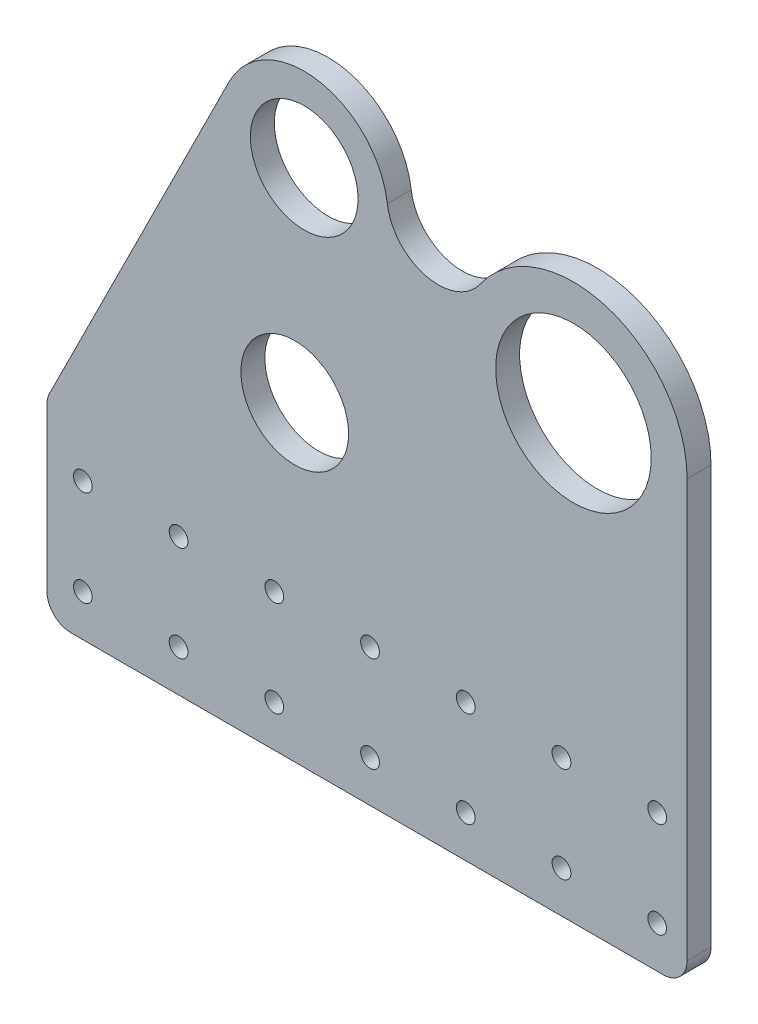
ISO-10303-21;
HEADER;
FILE_DESCRIPTION(('STEP AP214'),'2;1');
FILE_NAME('part.step','',(''),(''),'','','');
FILE_SCHEMA(('AUTOMOTIVE_DESIGN { 1 0 10303 214 1 1 1 1 }'));
ENDSEC;
DATA;
#1=APPLICATION_CONTEXT('core data for automotive mechanical design processes');
#2=APPLICATION_PROTOCOL_DEFINITION('international standard','automotive_design',2000,#1);
#3=PRODUCT_CONTEXT('',#1,'mechanical');
#4=PRODUCT('Part','Part','',(#3));
#5=PRODUCT_RELATED_PRODUCT_CATEGORY('part','',(#4));
#6=PRODUCT_DEFINITION_FORMATION('','',#4);
#7=PRODUCT_DEFINITION_CONTEXT('part definition',#1,'design');
#8=PRODUCT_DEFINITION('design','',#6,#7);
#9=PRODUCT_DEFINITION_SHAPE('','',#8);
#10=(LENGTH_UNIT() NAMED_UNIT(*) SI_UNIT(.MILLI.,.METRE.));
#11=(NAMED_UNIT(*) PLANE_ANGLE_UNIT() SI_UNIT($,.RADIAN.));
#12=(NAMED_UNIT(*) SI_UNIT($,.STERADIAN.) SOLID_ANGLE_UNIT());
#13=UNCERTAINTY_MEASURE_WITH_UNIT(LENGTH_MEASURE(1.E-05),#10,'distance_accuracy_value','');
#14=(GEOMETRIC_REPRESENTATION_CONTEXT(3) GLOBAL_UNCERTAINTY_ASSIGNED_CONTEXT((#13)) GLOBAL_UNIT_ASSIGNED_CONTEXT((#10,
#11,#12)) REPRESENTATION_CONTEXT('',''));
#15=CARTESIAN_POINT('',(0.,0.,0.));
#16=DIRECTION('',(0.,0.,1.));
#17=DIRECTION('',(1.,0.,0.));
#18=AXIS2_PLACEMENT_3D('',#15,#16,#17);
#19=CARTESIAN_POINT('',(609.6,111.4425,3.175));
#20=DIRECTION('',(0.,0.,-1.));
#21=DIRECTION('',(-1.,0.,0.));
#22=AXIS2_PLACEMENT_3D('',#19,#20,#21);
#23=CYLINDRICAL_SURFACE('',#22,2.48919999999995);
#24=CARTESIAN_POINT('',(609.6,111.4425,3.175));
#25=DIRECTION('',(0.,0.,1.));
#26=DIRECTION('',(1.,0.,0.));
#27=AXIS2_PLACEMENT_3D('',#24,#25,#26);
#28=CIRCLE('',#27,2.48919999999995);
#29=CARTESIAN_POINT('',(612.0892,111.4425,3.175));
#30=VERTEX_POINT('',#29);
#31=EDGE_CURVE('E260',#30,#30,#28,.T.);
#32=ORIENTED_EDGE('',*,*,#31,.T.);
#33=EDGE_LOOP('',(#32));
#34=FACE_BOUND('',#33,.T.);
#35=CARTESIAN_POINT('',(609.6,111.4425,-3.175));
#36=DIRECTION('',(0.,0.,1.));
#37=DIRECTION('',(1.,0.,0.));
#38=AXIS2_PLACEMENT_3D('',#35,#36,#37);
#39=CIRCLE('',#38,2.48919999999995);
#40=CARTESIAN_POINT('',(612.0892,111.4425,-3.175));
#41=VERTEX_POINT('',#40);
#42=EDGE_CURVE('E263',#41,#41,#39,.T.);
#43=ORIENTED_EDGE('',*,*,#42,.F.);
#44=EDGE_LOOP('',(#43));
#45=FACE_BOUND('',#44,.T.);
#46=ADVANCED_FACE('F39',(#34,#45),#23,.F.);
#47=CARTESIAN_POINT('',(609.6,136.8425,3.175));
#48=DIRECTION('',(0.,0.,-1.));
#49=DIRECTION('',(-1.,0.,0.));
#50=AXIS2_PLACEMENT_3D('',#47,#48,#49);
#51=CYLINDRICAL_SURFACE('',#50,2.48919999999995);
#52=CARTESIAN_POINT('',(609.6,136.8425,3.175));
#53=DIRECTION('',(0.,0.,1.));
#54=DIRECTION('',(1.,0.,0.));
#55=AXIS2_PLACEMENT_3D('',#52,#53,#54);
#56=CIRCLE('',#55,2.48919999999995);
#57=CARTESIAN_POINT('',(612.0892,136.8425,3.175));
#58=VERTEX_POINT('',#57);
#59=EDGE_CURVE('E254',#58,#58,#56,.T.);
#60=ORIENTED_EDGE('',*,*,#59,.T.);
#61=EDGE_LOOP('',(#60));
#62=FACE_BOUND('',#61,.T.);
#63=CARTESIAN_POINT('',(609.6,136.8425,-3.175));
#64=DIRECTION('',(0.,0.,1.));
#65=DIRECTION('',(1.,0.,0.));
#66=AXIS2_PLACEMENT_3D('',#63,#64,#65);
#67=CIRCLE('',#66,2.48919999999995);
#68=CARTESIAN_POINT('',(612.0892,136.8425,-3.175));
#69=VERTEX_POINT('',#68);
#70=EDGE_CURVE('E257',#69,#69,#67,.T.);
#71=ORIENTED_EDGE('',*,*,#70,.F.);
#72=EDGE_LOOP('',(#71));
#73=FACE_BOUND('',#72,.T.);
#74=ADVANCED_FACE('F321',(#62,#73),#51,.F.);
#75=CARTESIAN_POINT('',(584.2,111.4425,3.175));
#76=DIRECTION('',(0.,0.,-1.));
#77=DIRECTION('',(-1.,0.,0.));
#78=AXIS2_PLACEMENT_3D('',#75,#76,#77);
#79=CYLINDRICAL_SURFACE('',#78,2.48919999999995);
#80=CARTESIAN_POINT('',(584.2,111.4425,3.175));
#81=DIRECTION('',(0.,0.,1.));
#82=DIRECTION('',(1.,0.,0.));
#83=AXIS2_PLACEMENT_3D('',#80,#81,#82);
#84=CIRCLE('',#83,2.48919999999995);
#85=CARTESIAN_POINT('',(586.6892,111.4425,3.175));
#86=VERTEX_POINT('',#85);
#87=EDGE_CURVE('E248',#86,#86,#84,.T.);
#88=ORIENTED_EDGE('',*,*,#87,.T.);
#89=EDGE_LOOP('',(#88));
#90=FACE_BOUND('',#89,.T.);
#91=CARTESIAN_POINT('',(584.2,111.4425,-3.175));
#92=DIRECTION('',(0.,0.,1.));
#93=DIRECTION('',(1.,0.,0.));
#94=AXIS2_PLACEMENT_3D('',#91,#92,#93);
#95=CIRCLE('',#94,2.48919999999995);
#96=CARTESIAN_POINT('',(586.6892,111.4425,-3.175));
#97=VERTEX_POINT('',#96);
#98=EDGE_CURVE('E251',#97,#97,#95,.T.);
#99=ORIENTED_EDGE('',*,*,#98,.F.);
#100=EDGE_LOOP('',(#99));
#101=FACE_BOUND('',#100,.T.);
#102=ADVANCED_FACE('F327',(#90,#101),#79,.F.);
#103=CARTESIAN_POINT('',(584.2,136.8425,3.175));
#104=DIRECTION('',(0.,0.,-1.));
#105=DIRECTION('',(-1.,0.,0.));
#106=AXIS2_PLACEMENT_3D('',#103,#104,#105);
#107=CYLINDRICAL_SURFACE('',#106,2.48919999999995);
#108=CARTESIAN_POINT('',(584.2,136.8425,3.175));
#109=DIRECTION('',(0.,0.,1.));
#110=DIRECTION('',(1.,0.,0.));
#111=AXIS2_PLACEMENT_3D('',#108,#109,#110);
#112=CIRCLE('',#111,2.48919999999995);
#113=CARTESIAN_POINT('',(586.6892,136.8425,3.175));
#114=VERTEX_POINT('',#113);
#115=EDGE_CURVE('E242',#114,#114,#112,.T.);
#116=ORIENTED_EDGE('',*,*,#115,.T.);
#117=EDGE_LOOP('',(#116));
#118=FACE_BOUND('',#117,.T.);
#119=CARTESIAN_POINT('',(584.2,136.8425,-3.175));
#120=DIRECTION('',(0.,0.,1.));
#121=DIRECTION('',(1.,0.,0.));
#122=AXIS2_PLACEMENT_3D('',#119,#120,#121);
#123=CIRCLE('',#122,2.48919999999995);
#124=CARTESIAN_POINT('',(586.6892,136.8425,-3.175));
#125=VERTEX_POINT('',#124);
#126=EDGE_CURVE('E245',#125,#125,#123,.T.);
#127=ORIENTED_EDGE('',*,*,#126,.F.);
#128=EDGE_LOOP('',(#127));
#129=FACE_BOUND('',#128,.T.);
#130=ADVANCED_FACE('F411',(#118,#129),#107,.F.);
#131=CARTESIAN_POINT('',(558.8,111.4425,3.175));
#132=DIRECTION('',(0.,0.,-1.));
#133=DIRECTION('',(-1.,0.,0.));
#134=AXIS2_PLACEMENT_3D('',#131,#132,#133);
#135=CYLINDRICAL_SURFACE('',#134,2.48919999999995);
#136=CARTESIAN_POINT('',(558.8,111.4425,3.175));
#137=DIRECTION('',(0.,0.,1.));
#138=DIRECTION('',(1.,0.,0.));
#139=AXIS2_PLACEMENT_3D('',#136,#137,#138);
#140=CIRCLE('',#139,2.48919999999995);
#141=CARTESIAN_POINT('',(561.2892,111.4425,3.175));
#142=VERTEX_POINT('',#141);
#143=EDGE_CURVE('E236',#142,#142,#140,.T.);
#144=ORIENTED_EDGE('',*,*,#143,.T.);
#145=EDGE_LOOP('',(#144));
#146=FACE_BOUND('',#145,.T.);
#147=CARTESIAN_POINT('',(558.8,111.4425,-3.175));
#148=DIRECTION('',(0.,0.,1.));
#149=DIRECTION('',(1.,0.,0.));
#150=AXIS2_PLACEMENT_3D('',#147,#148,#149);
#151=CIRCLE('',#150,2.48919999999995);
#152=CARTESIAN_POINT('',(561.2892,111.4425,-3.175));
#153=VERTEX_POINT('',#152);
#154=EDGE_CURVE('E239',#153,#153,#151,.T.);
#155=ORIENTED_EDGE('',*,*,#154,.F.);
#156=EDGE_LOOP('',(#155));
#157=FACE_BOUND('',#156,.T.);
#158=ADVANCED_FACE('F407',(#146,#157),#135,.F.);
#159=CARTESIAN_POINT('',(558.8,136.8425,3.175));
#160=DIRECTION('',(0.,0.,-1.));
#161=DIRECTION('',(-1.,0.,0.));
#162=AXIS2_PLACEMENT_3D('',#159,#160,#161);
#163=CYLINDRICAL_SURFACE('',#162,2.48919999999995);
#164=CARTESIAN_POINT('',(558.8,136.8425,3.175));
#165=DIRECTION('',(0.,0.,1.));
#166=DIRECTION('',(1.,0.,0.));
#167=AXIS2_PLACEMENT_3D('',#164,#165,#166);
#168=CIRCLE('',#167,2.48919999999995);
#169=CARTESIAN_POINT('',(561.2892,136.8425,3.175));
#170=VERTEX_POINT('',#169);
#171=EDGE_CURVE('E230',#170,#170,#168,.T.);
#172=ORIENTED_EDGE('',*,*,#171,.T.);
#173=EDGE_LOOP('',(#172));
#174=FACE_BOUND('',#173,.T.);
#175=CARTESIAN_POINT('',(558.8,136.8425,-3.175));
#176=DIRECTION('',(0.,0.,1.));
#177=DIRECTION('',(1.,0.,0.));
#178=AXIS2_PLACEMENT_3D('',#175,#176,#177);
#179=CIRCLE('',#178,2.48919999999995);
#180=CARTESIAN_POINT('',(561.2892,136.8425,-3.175));
#181=VERTEX_POINT('',#180);
#182=EDGE_CURVE('E233',#181,#181,#179,.T.);
#183=ORIENTED_EDGE('',*,*,#182,.F.);
#184=EDGE_LOOP('',(#183));
#185=FACE_BOUND('',#184,.T.);
#186=ADVANCED_FACE('F403',(#174,#185),#163,.F.);
#187=CARTESIAN_POINT('',(533.4,111.4425,3.175));
#188=DIRECTION('',(0.,0.,-1.));
#189=DIRECTION('',(-1.,0.,0.));
#190=AXIS2_PLACEMENT_3D('',#187,#188,#189);
#191=CYLINDRICAL_SURFACE('',#190,2.48919999999995);
#192=CARTESIAN_POINT('',(533.4,111.4425,3.175));
#193=DIRECTION('',(0.,0.,1.));
#194=DIRECTION('',(1.,0.,0.));
#195=AXIS2_PLACEMENT_3D('',#192,#193,#194);
#196=CIRCLE('',#195,2.48919999999995);
#197=CARTESIAN_POINT('',(535.8892,111.4425,3.175));
#198=VERTEX_POINT('',#197);
#199=EDGE_CURVE('E224',#198,#198,#196,.T.);
#200=ORIENTED_EDGE('',*,*,#199,.T.);
#201=EDGE_LOOP('',(#200));
#202=FACE_BOUND('',#201,.T.);
#203=CARTESIAN_POINT('',(533.4,111.4425,-3.175));
#204=DIRECTION('',(0.,0.,1.));
#205=DIRECTION('',(1.,0.,0.));
#206=AXIS2_PLACEMENT_3D('',#203,#204,#205);
#207=CIRCLE('',#206,2.48919999999995);
#208=CARTESIAN_POINT('',(535.8892,111.4425,-3.175));
#209=VERTEX_POINT('',#208);
#210=EDGE_CURVE('E227',#209,#209,#207,.T.);
#211=ORIENTED_EDGE('',*,*,#210,.F.);
#212=EDGE_LOOP('',(#211));
#213=FACE_BOUND('',#212,.T.);
#214=ADVANCED_FACE('F399',(#202,#213),#191,.F.);
#215=CARTESIAN_POINT('',(533.4,136.8425,3.175));
#216=DIRECTION('',(0.,0.,-1.));
#217=DIRECTION('',(-1.,0.,0.));
#218=AXIS2_PLACEMENT_3D('',#215,#216,#217);
#219=CYLINDRICAL_SURFACE('',#218,2.48919999999995);
#220=CARTESIAN_POINT('',(533.4,136.8425,3.175));
#221=DIRECTION('',(0.,0.,1.));
#222=DIRECTION('',(1.,0.,0.));
#223=AXIS2_PLACEMENT_3D('',#220,#221,#222);
#224=CIRCLE('',#223,2.48919999999995);
#225=CARTESIAN_POINT('',(535.8892,136.8425,3.175));
#226=VERTEX_POINT('',#225);
#227=EDGE_CURVE('E218',#226,#226,#224,.T.);
#228=ORIENTED_EDGE('',*,*,#227,.T.);
#229=EDGE_LOOP('',(#228));
#230=FACE_BOUND('',#229,.T.);
#231=CARTESIAN_POINT('',(533.4,136.8425,-3.175));
#232=DIRECTION('',(0.,0.,1.));
#233=DIRECTION('',(1.,0.,0.));
#234=AXIS2_PLACEMENT_3D('',#231,#232,#233);
#235=CIRCLE('',#234,2.48919999999995);
#236=CARTESIAN_POINT('',(535.8892,136.8425,-3.175));
#237=VERTEX_POINT('',#236);
#238=EDGE_CURVE('E221',#237,#237,#235,.T.);
#239=ORIENTED_EDGE('',*,*,#238,.F.);
#240=EDGE_LOOP('',(#239));
#241=FACE_BOUND('',#240,.T.);
#242=ADVANCED_FACE('F395',(#230,#241),#219,.F.);
#243=CARTESIAN_POINT('',(508.,111.4425,3.175));
#244=DIRECTION('',(0.,0.,-1.));
#245=DIRECTION('',(-1.,0.,0.));
#246=AXIS2_PLACEMENT_3D('',#243,#244,#245);
#247=CYLINDRICAL_SURFACE('',#246,2.48919999999995);
#248=CARTESIAN_POINT('',(508.,111.4425,3.175));
#249=DIRECTION('',(0.,0.,1.));
#250=DIRECTION('',(1.,0.,0.));
#251=AXIS2_PLACEMENT_3D('',#248,#249,#250);
#252=CIRCLE('',#251,2.48919999999995);
#253=CARTESIAN_POINT('',(510.4892,111.4425,3.175));
#254=VERTEX_POINT('',#253);
#255=EDGE_CURVE('E212',#254,#254,#252,.T.);
#256=ORIENTED_EDGE('',*,*,#255,.T.);
#257=EDGE_LOOP('',(#256));
#258=FACE_BOUND('',#257,.T.);
#259=CARTESIAN_POINT('',(508.,111.4425,-3.175));
#260=DIRECTION('',(0.,0.,1.));
#261=DIRECTION('',(1.,0.,0.));
#262=AXIS2_PLACEMENT_3D('',#259,#260,#261);
#263=CIRCLE('',#262,2.48919999999995);
#264=CARTESIAN_POINT('',(510.4892,111.4425,-3.175));
#265=VERTEX_POINT('',#264);
#266=EDGE_CURVE('E215',#265,#265,#263,.T.);
#267=ORIENTED_EDGE('',*,*,#266,.F.);
#268=EDGE_LOOP('',(#267));
#269=FACE_BOUND('',#268,.T.);
#270=ADVANCED_FACE('F391',(#258,#269),#247,.F.);
#271=CARTESIAN_POINT('',(508.,136.8425,3.175));
#272=DIRECTION('',(0.,0.,-1.));
#273=DIRECTION('',(-1.,0.,0.));
#274=AXIS2_PLACEMENT_3D('',#271,#272,#273);
#275=CYLINDRICAL_SURFACE('',#274,2.48919999999995);
#276=CARTESIAN_POINT('',(508.,136.8425,3.175));
#277=DIRECTION('',(0.,0.,1.));
#278=DIRECTION('',(1.,0.,0.));
#279=AXIS2_PLACEMENT_3D('',#276,#277,#278);
#280=CIRCLE('',#279,2.48919999999995);
#281=CARTESIAN_POINT('',(510.4892,136.8425,3.175));
#282=VERTEX_POINT('',#281);
#283=EDGE_CURVE('E206',#282,#282,#280,.T.);
#284=ORIENTED_EDGE('',*,*,#283,.T.);
#285=EDGE_LOOP('',(#284));
#286=FACE_BOUND('',#285,.T.);
#287=CARTESIAN_POINT('',(508.,136.8425,-3.175));
#288=DIRECTION('',(0.,0.,1.));
#289=DIRECTION('',(1.,0.,0.));
#290=AXIS2_PLACEMENT_3D('',#287,#288,#289);
#291=CIRCLE('',#290,2.48919999999995);
#292=CARTESIAN_POINT('',(510.4892,136.8425,-3.175));
#293=VERTEX_POINT('',#292);
#294=EDGE_CURVE('E209',#293,#293,#291,.T.);
#295=ORIENTED_EDGE('',*,*,#294,.F.);
#296=EDGE_LOOP('',(#295));
#297=FACE_BOUND('',#296,.T.);
#298=ADVANCED_FACE('F387',(#286,#297),#275,.F.);
#299=CARTESIAN_POINT('',(482.6,111.4425,3.175));
#300=DIRECTION('',(0.,0.,-1.));
#301=DIRECTION('',(-1.,0.,0.));
#302=AXIS2_PLACEMENT_3D('',#299,#300,#301);
#303=CYLINDRICAL_SURFACE('',#302,2.48919999999995);
#304=CARTESIAN_POINT('',(482.6,111.4425,3.175));
#305=DIRECTION('',(0.,0.,1.));
#306=DIRECTION('',(1.,0.,0.));
#307=AXIS2_PLACEMENT_3D('',#304,#305,#306);
#308=CIRCLE('',#307,2.48919999999995);
#309=CARTESIAN_POINT('',(485.0892,111.4425,3.175));
#310=VERTEX_POINT('',#309);
#311=EDGE_CURVE('E200',#310,#310,#308,.T.);
#312=ORIENTED_EDGE('',*,*,#311,.T.);
#313=EDGE_LOOP('',(#312));
#314=FACE_BOUND('',#313,.T.);
#315=CARTESIAN_POINT('',(482.6,111.4425,-3.175));
#316=DIRECTION('',(0.,0.,1.));
#317=DIRECTION('',(1.,0.,0.));
#318=AXIS2_PLACEMENT_3D('',#315,#316,#317);
#319=CIRCLE('',#318,2.48919999999995);
#320=CARTESIAN_POINT('',(485.0892,111.4425,-3.175));
#321=VERTEX_POINT('',#320);
#322=EDGE_CURVE('E203',#321,#321,#319,.T.);
#323=ORIENTED_EDGE('',*,*,#322,.F.);
#324=EDGE_LOOP('',(#323));
#325=FACE_BOUND('',#324,.T.);
#326=ADVANCED_FACE('F383',(#314,#325),#303,.F.);
#327=CARTESIAN_POINT('',(482.6,136.8425,3.175));
#328=DIRECTION('',(0.,0.,-1.));
#329=DIRECTION('',(-1.,0.,0.));
#330=AXIS2_PLACEMENT_3D('',#327,#328,#329);
#331=CYLINDRICAL_SURFACE('',#330,2.48919999999995);
#332=CARTESIAN_POINT('',(482.6,136.8425,3.175));
#333=DIRECTION('',(0.,0.,1.));
#334=DIRECTION('',(1.,0.,0.));
#335=AXIS2_PLACEMENT_3D('',#332,#333,#334);
#336=CIRCLE('',#335,2.48919999999995);
#337=CARTESIAN_POINT('',(485.0892,136.8425,3.175));
#338=VERTEX_POINT('',#337);
#339=EDGE_CURVE('E127',#338,#338,#336,.T.);
#340=ORIENTED_EDGE('',*,*,#339,.T.);
#341=EDGE_LOOP('',(#340));
#342=FACE_BOUND('',#341,.T.);
#343=CARTESIAN_POINT('',(482.6,136.8425,-3.175));
#344=DIRECTION('',(0.,0.,1.));
#345=DIRECTION('',(1.,0.,0.));
#346=AXIS2_PLACEMENT_3D('',#343,#344,#345);
#347=CIRCLE('',#346,2.48919999999995);
#348=CARTESIAN_POINT('',(485.0892,136.8425,-3.175));
#349=VERTEX_POINT('',#348);
#350=EDGE_CURVE('E197',#349,#349,#347,.T.);
#351=ORIENTED_EDGE('',*,*,#350,.F.);
#352=EDGE_LOOP('',(#351));
#353=FACE_BOUND('',#352,.T.);
#354=ADVANCED_FACE('F362',(#342,#353),#331,.F.);
#355=CARTESIAN_POINT('',(551.528534377815,242.755181923313,3.175));
#356=DIRECTION('',(0.,0.,-1.));
#357=DIRECTION('',(-1.,0.,0.));
#358=AXIS2_PLACEMENT_3D('',#355,#356,#357);
#359=CYLINDRICAL_SURFACE('',#358,13.6578136002693);
#360=CARTESIAN_POINT('',(551.528534377815,242.755181923313,-3.175));
#361=DIRECTION('',(0.,0.,1.));
#362=DIRECTION('',(1.,0.,0.));
#363=AXIS2_PLACEMENT_3D('',#360,#361,#362);
#364=CIRCLE('',#363,13.6578136002693);
#365=CARTESIAN_POINT('',(537.981778574659,241.01699909364,-3.175));
#366=VERTEX_POINT('',#365);
#367=CARTESIAN_POINT('',(562.701077554075,234.899601020903,-3.175));
#368=VERTEX_POINT('',#367);
#369=EDGE_CURVE('E123',#366,#368,#364,.T.);
#370=ORIENTED_EDGE('',*,*,#369,.F.);
#371=DIRECTION('',(0.,0.,-1.));
#372=VECTOR('',#371,1.);
#373=CARTESIAN_POINT('',(537.981778574659,241.01699909364,3.175));
#374=LINE('',#373,#372);
#375=CARTESIAN_POINT('',(537.981778574659,241.01699909364,3.175));
#376=VERTEX_POINT('',#375);
#377=EDGE_CURVE('E117',#376,#366,#374,.T.);
#378=ORIENTED_EDGE('',*,*,#377,.F.);
#379=CARTESIAN_POINT('',(551.528534377815,242.755181923313,3.175));
#380=DIRECTION('',(0.,0.,1.));
#381=DIRECTION('',(1.,0.,0.));
#382=AXIS2_PLACEMENT_3D('',#379,#380,#381);
#383=CIRCLE('',#382,13.6578136002693);
#384=CARTESIAN_POINT('',(562.701077554075,234.899601020903,3.175));
#385=VERTEX_POINT('',#384);
#386=EDGE_CURVE('E121',#376,#385,#383,.T.);
#387=ORIENTED_EDGE('',*,*,#386,.T.);
#388=DIRECTION('',(0.,0.,-1.));
#389=VECTOR('',#388,1.);
#390=CARTESIAN_POINT('',(562.701077554075,234.899601020903,3.175));
#391=LINE('',#390,#389);
#392=EDGE_CURVE('E158',#385,#368,#391,.T.);
#393=ORIENTED_EDGE('',*,*,#392,.T.);
#394=EDGE_LOOP('',(#370,#378,#387,#393));
#395=FACE_BOUND('',#394,.T.);
#396=ADVANCED_FACE('F119',(#395),#359,.F.);
#397=CARTESIAN_POINT('',(515.937499999998,238.1885,3.175));
#398=DIRECTION('',(0.,0.,-1.));
#399=DIRECTION('',(-1.,0.,0.));
#400=AXIS2_PLACEMENT_3D('',#397,#398,#399);
#401=CYLINDRICAL_SURFACE('',#400,22.225);
#402=CARTESIAN_POINT('',(515.937499999998,238.1885,-3.175));
#403=DIRECTION('',(0.,0.,1.));
#404=DIRECTION('',(1.,0.,0.));
#405=AXIS2_PLACEMENT_3D('',#402,#403,#404);
#406=CIRCLE('',#405,22.225);
#407=CARTESIAN_POINT('',(496.052024065169,248.114147175139,-3.175));
#408=VERTEX_POINT('',#407);
#409=EDGE_CURVE('E175',#366,#408,#406,.T.);
#410=ORIENTED_EDGE('',*,*,#409,.T.);
#411=DIRECTION('',(0.,0.,-1.));
#412=VECTOR('',#411,1.);
#413=CARTESIAN_POINT('',(496.052024065169,248.114147175139,3.175));
#414=LINE('',#413,#412);
#415=CARTESIAN_POINT('',(496.052024065169,248.114147175139,3.175));
#416=VERTEX_POINT('',#415);
#417=EDGE_CURVE('E128',#416,#408,#414,.T.);
#418=ORIENTED_EDGE('',*,*,#417,.F.);
#419=CARTESIAN_POINT('',(515.937499999998,238.1885,3.175));
#420=DIRECTION('',(0.,0.,1.));
#421=DIRECTION('',(1.,0.,0.));
#422=AXIS2_PLACEMENT_3D('',#419,#420,#421);
#423=CIRCLE('',#422,22.225);
#424=EDGE_CURVE('E132',#376,#416,#423,.T.);
#425=ORIENTED_EDGE('',*,*,#424,.F.);
#426=ORIENTED_EDGE('',*,*,#377,.T.);
#427=EDGE_LOOP('',(#410,#418,#425,#426));
#428=FACE_BOUND('',#427,.T.);
#429=ADVANCED_FACE('F133',(#428),#401,.T.);
#430=CARTESIAN_POINT('',(297.971255611748,-148.729533113928,3.175));
#431=DIRECTION('',(-0.894734575245392,0.446598298093989,0.));
#432=DIRECTION('',(-0.446598298093989,-0.894734575245392,0.));
#433=AXIS2_PLACEMENT_3D('',#430,#431,#432);
#434=PLANE('',#433);
#435=DIRECTION('',(0.446598298093989,0.894734575245392,0.));
#436=VECTOR('',#435,1.);
#437=CARTESIAN_POINT('',(297.971255611748,-148.729533113928,-3.175));
#438=LINE('',#437,#436);
#439=CARTESIAN_POINT('',(448.343435447192,152.532672828187,-3.175));
#440=VERTEX_POINT('',#439);
#441=EDGE_CURVE('E177',#440,#408,#438,.T.);
#442=ORIENTED_EDGE('',*,*,#441,.F.);
#443=DIRECTION('',(0.,0.,-1.));
#444=VECTOR('',#443,1.);
#445=CARTESIAN_POINT('',(448.343435447192,152.532672828187,3.175));
#446=LINE('',#445,#444);
#447=CARTESIAN_POINT('',(448.343435447192,152.532672828187,3.175));
#448=VERTEX_POINT('',#447);
#449=EDGE_CURVE('E277',#440,#448,#446,.F.);
#450=ORIENTED_EDGE('',*,*,#449,.T.);
#451=DIRECTION('',(0.446598298093989,0.894734575245392,0.));
#452=VECTOR('',#451,1.);
#453=CARTESIAN_POINT('',(297.971255611748,-148.729533113928,3.175));
#454=LINE('',#453,#452);
#455=EDGE_CURVE('E136',#448,#416,#454,.T.);
#456=ORIENTED_EDGE('',*,*,#455,.T.);
#457=ORIENTED_EDGE('',*,*,#417,.T.);
#458=EDGE_LOOP('',(#442,#450,#456,#457));
#459=FACE_BOUND('',#458,.T.);
#460=ADVANCED_FACE('F307',(#459),#434,.T.);
#461=CARTESIAN_POINT('',(447.675,0.,3.175));
#462=DIRECTION('',(-1.,0.,0.));
#463=DIRECTION('',(0.,0.,1.));
#464=AXIS2_PLACEMENT_3D('',#461,#462,#463);
#465=PLANE('',#464);
#466=DIRECTION('',(0.,1.,0.));
#467=VECTOR('',#466,1.);
#468=CARTESIAN_POINT('',(447.675,0.,3.175));
#469=LINE('',#468,#467);
#470=CARTESIAN_POINT('',(447.675,106.7435,3.175));
#471=VERTEX_POINT('',#470);
#472=CARTESIAN_POINT('',(447.675,149.69677363529,3.175));
#473=VERTEX_POINT('',#472);
#474=EDGE_CURVE('E150',#471,#473,#469,.T.);
#475=ORIENTED_EDGE('',*,*,#474,.T.);
#476=DIRECTION('',(0.,0.,-1.));
#477=VECTOR('',#476,1.);
#478=CARTESIAN_POINT('',(447.675,149.69677363529,3.175));
#479=LINE('',#478,#477);
#480=CARTESIAN_POINT('',(447.675,149.69677363529,-3.175));
#481=VERTEX_POINT('',#480);
#482=EDGE_CURVE('E268',#473,#481,#479,.T.);
#483=ORIENTED_EDGE('',*,*,#482,.T.);
#484=DIRECTION('',(0.,1.,0.));
#485=VECTOR('',#484,1.);
#486=CARTESIAN_POINT('',(447.675,0.,-3.175));
#487=LINE('',#486,#485);
#488=CARTESIAN_POINT('',(447.675,106.7435,-3.175));
#489=VERTEX_POINT('',#488);
#490=EDGE_CURVE('E179',#489,#481,#487,.T.);
#491=ORIENTED_EDGE('',*,*,#490,.F.);
#492=DIRECTION('',(0.,0.,-1.));
#493=VECTOR('',#492,1.);
#494=CARTESIAN_POINT('',(447.675,106.7435,3.175));
#495=LINE('',#494,#493);
#496=EDGE_CURVE('E266',#489,#471,#495,.F.);
#497=ORIENTED_EDGE('',*,*,#496,.T.);
#498=EDGE_LOOP('',(#475,#483,#491,#497));
#499=FACE_BOUND('',#498,.T.);
#500=ADVANCED_FACE('F314',(#499),#465,.T.);
#501=CARTESIAN_POINT('',(0.,100.3935,3.175));
#502=DIRECTION('',(0.,1.,0.));
#503=DIRECTION('',(0.,0.,1.));
#504=AXIS2_PLACEMENT_3D('',#501,#502,#503);
#505=PLANE('',#504);
#506=DIRECTION('',(1.,0.,0.));
#507=VECTOR('',#506,1.);
#508=CARTESIAN_POINT('',(0.,100.3935,-3.175));
#509=LINE('',#508,#507);
#510=CARTESIAN_POINT('',(454.025,100.3935,-3.175));
#511=VERTEX_POINT('',#510);
#512=CARTESIAN_POINT('',(611.1875,100.3935,-3.175));
#513=VERTEX_POINT('',#512);
#514=EDGE_CURVE('E182',#511,#513,#509,.T.);
#515=ORIENTED_EDGE('',*,*,#514,.T.);
#516=DIRECTION('',(0.,0.,-1.));
#517=VECTOR('',#516,1.);
#518=CARTESIAN_POINT('',(611.1875,100.3935,3.175));
#519=LINE('',#518,#517);
#520=CARTESIAN_POINT('',(611.1875,100.3935,3.175));
#521=VERTEX_POINT('',#520);
#522=EDGE_CURVE('E11',#513,#521,#519,.F.);
#523=ORIENTED_EDGE('',*,*,#522,.T.);
#524=DIRECTION('',(1.,0.,0.));
#525=VECTOR('',#524,1.);
#526=CARTESIAN_POINT('',(0.,100.3935,3.175));
#527=LINE('',#526,#525);
#528=CARTESIAN_POINT('',(454.025,100.3935,3.175));
#529=VERTEX_POINT('',#528);
#530=EDGE_CURVE('E153',#529,#521,#527,.T.);
#531=ORIENTED_EDGE('',*,*,#530,.F.);
#532=DIRECTION('',(0.,0.,-1.));
#533=VECTOR('',#532,1.);
#534=CARTESIAN_POINT('',(454.025,100.3935,-3.175));
#535=LINE('',#534,#533);
#536=EDGE_CURVE('E47',#529,#511,#535,.T.);
#537=ORIENTED_EDGE('',*,*,#536,.T.);
#538=EDGE_LOOP('',(#515,#523,#531,#537));
#539=FACE_BOUND('',#538,.T.);
#540=ADVANCED_FACE('F289',(#539),#505,.F.);
#541=CARTESIAN_POINT('',(617.5375,0.,3.175));
#542=DIRECTION('',(1.,0.,0.));
#543=DIRECTION('',(0.,0.,-1.));
#544=AXIS2_PLACEMENT_3D('',#541,#542,#543);
#545=PLANE('',#544);
#546=DIRECTION('',(0.,-1.,0.));
#547=VECTOR('',#546,1.);
#548=CARTESIAN_POINT('',(617.5375,0.,3.175));
#549=LINE('',#548,#547);
#550=CARTESIAN_POINT('',(617.5375,217.551,3.175));
#551=VERTEX_POINT('',#550);
#552=CARTESIAN_POINT('',(617.5375,106.7435,3.175));
#553=VERTEX_POINT('',#552);
#554=EDGE_CURVE('E155',#551,#553,#549,.T.);
#555=ORIENTED_EDGE('',*,*,#554,.T.);
#556=DIRECTION('',(0.,0.,-1.));
#557=VECTOR('',#556,1.);
#558=CARTESIAN_POINT('',(617.5375,106.7435,-3.175));
#559=LINE('',#558,#557);
#560=CARTESIAN_POINT('',(617.5375,106.7435,-3.175));
#561=VERTEX_POINT('',#560);
#562=EDGE_CURVE('E284',#553,#561,#559,.T.);
#563=ORIENTED_EDGE('',*,*,#562,.T.);
#564=DIRECTION('',(0.,-1.,0.));
#565=VECTOR('',#564,1.);
#566=CARTESIAN_POINT('',(617.5375,0.,-3.175));
#567=LINE('',#566,#565);
#568=CARTESIAN_POINT('',(617.5375,217.551,-3.175));
#569=VERTEX_POINT('',#568);
#570=EDGE_CURVE('E184',#569,#561,#567,.T.);
#571=ORIENTED_EDGE('',*,*,#570,.F.);
#572=DIRECTION('',(0.,0.,-1.));
#573=VECTOR('',#572,1.);
#574=CARTESIAN_POINT('',(617.5375,217.551,3.175));
#575=LINE('',#574,#573);
#576=EDGE_CURVE('E192',#551,#569,#575,.T.);
#577=ORIENTED_EDGE('',*,*,#576,.F.);
#578=EDGE_LOOP('',(#555,#563,#571,#577));
#579=FACE_BOUND('',#578,.T.);
#580=ADVANCED_FACE('F301',(#579),#545,.T.);
#581=CARTESIAN_POINT('',(457.2,136.8425,3.175));
#582=DIRECTION('',(0.,0.,-1.));
#583=DIRECTION('',(-1.,0.,0.));
#584=AXIS2_PLACEMENT_3D('',#581,#582,#583);
#585=CYLINDRICAL_SURFACE('',#584,2.48919999999995);
#586=CARTESIAN_POINT('',(457.2,136.8425,3.175));
#587=DIRECTION('',(0.,0.,1.));
#588=DIRECTION('',(1.,0.,0.));
#589=AXIS2_PLACEMENT_3D('',#586,#587,#588);
#590=CIRCLE('',#589,2.48919999999995);
#591=CARTESIAN_POINT('',(459.6892,136.8425,3.175));
#592=VERTEX_POINT('',#591);
#593=EDGE_CURVE('E142',#592,#592,#590,.T.);
#594=ORIENTED_EDGE('',*,*,#593,.T.);
#595=EDGE_LOOP('',(#594));
#596=FACE_BOUND('',#595,.T.);
#597=CARTESIAN_POINT('',(457.2,136.8425,-3.175));
#598=DIRECTION('',(0.,0.,1.));
#599=DIRECTION('',(1.,0.,0.));
#600=AXIS2_PLACEMENT_3D('',#597,#598,#599);
#601=CIRCLE('',#600,2.48919999999995);
#602=CARTESIAN_POINT('',(459.6892,136.8425,-3.175));
#603=VERTEX_POINT('',#602);
#604=EDGE_CURVE('E171',#603,#603,#601,.T.);
#605=ORIENTED_EDGE('',*,*,#604,.F.);
#606=EDGE_LOOP('',(#605));
#607=FACE_BOUND('',#606,.T.);
#608=ADVANCED_FACE('F351',(#596,#607),#585,.F.);
#609=CARTESIAN_POINT('',(457.2,111.4425,3.175));
#610=DIRECTION('',(0.,0.,-1.));
#611=DIRECTION('',(-1.,0.,0.));
#612=AXIS2_PLACEMENT_3D('',#609,#610,#611);
#613=CYLINDRICAL_SURFACE('',#612,2.48919999999995);
#614=CARTESIAN_POINT('',(457.2,111.4425,3.175));
#615=DIRECTION('',(0.,0.,1.));
#616=DIRECTION('',(1.,0.,0.));
#617=AXIS2_PLACEMENT_3D('',#614,#615,#616);
#618=CIRCLE('',#617,2.48919999999995);
#619=CARTESIAN_POINT('',(459.6892,111.4425,3.175));
#620=VERTEX_POINT('',#619);
#621=EDGE_CURVE('E145',#620,#620,#618,.T.);
#622=ORIENTED_EDGE('',*,*,#621,.T.);
#623=EDGE_LOOP('',(#622));
#624=FACE_BOUND('',#623,.T.);
#625=CARTESIAN_POINT('',(457.2,111.4425,-3.175));
#626=DIRECTION('',(0.,0.,1.));
#627=DIRECTION('',(1.,0.,0.));
#628=AXIS2_PLACEMENT_3D('',#625,#626,#627);
#629=CIRCLE('',#628,2.48919999999995);
#630=CARTESIAN_POINT('',(459.6892,111.4425,-3.175));
#631=VERTEX_POINT('',#630);
#632=EDGE_CURVE('E168',#631,#631,#629,.T.);
#633=ORIENTED_EDGE('',*,*,#632,.F.);
#634=EDGE_LOOP('',(#633));
#635=FACE_BOUND('',#634,.T.);
#636=ADVANCED_FACE('F365',(#624,#635),#613,.F.);
#637=CARTESIAN_POINT('',(513.421091269929,182.9435,3.175));
#638=DIRECTION('',(0.,0.,-1.));
#639=DIRECTION('',(-1.,0.,0.));
#640=AXIS2_PLACEMENT_3D('',#637,#638,#639);
#641=CYLINDRICAL_SURFACE('',#640,14.2875);
#642=CARTESIAN_POINT('',(513.421091269929,182.9435,3.175));
#643=DIRECTION('',(0.,0.,1.));
#644=DIRECTION('',(1.,0.,0.));
#645=AXIS2_PLACEMENT_3D('',#642,#643,#644);
#646=CIRCLE('',#645,14.2875);
#647=CARTESIAN_POINT('',(527.708591269929,182.9435,3.175));
#648=VERTEX_POINT('',#647);
#649=EDGE_CURVE('E490',#648,#648,#646,.T.);
#650=ORIENTED_EDGE('',*,*,#649,.T.);
#651=EDGE_LOOP('',(#650));
#652=FACE_BOUND('',#651,.T.);
#653=CARTESIAN_POINT('',(513.421091269929,182.9435,-3.175));
#654=DIRECTION('',(0.,0.,1.));
#655=DIRECTION('',(1.,0.,0.));
#656=AXIS2_PLACEMENT_3D('',#653,#654,#655);
#657=CIRCLE('',#656,14.2875);
#658=CARTESIAN_POINT('',(527.708591269929,182.9435,-3.175));
#659=VERTEX_POINT('',#658);
#660=EDGE_CURVE('E165',#659,#659,#657,.T.);
#661=ORIENTED_EDGE('',*,*,#660,.F.);
#662=EDGE_LOOP('',(#661));
#663=FACE_BOUND('',#662,.T.);
#664=ADVANCED_FACE('F369',(#652,#663),#641,.F.);
#665=CARTESIAN_POINT('',(587.375,217.551,3.175));
#666=DIRECTION('',(0.,0.,-1.));
#667=DIRECTION('',(-1.,0.,0.));
#668=AXIS2_PLACEMENT_3D('',#665,#666,#667);
#669=CYLINDRICAL_SURFACE('',#668,20.6375);
#670=CARTESIAN_POINT('',(587.375,217.551,3.175));
#671=DIRECTION('',(0.,0.,1.));
#672=DIRECTION('',(1.,0.,0.));
#673=AXIS2_PLACEMENT_3D('',#670,#671,#672);
#674=CIRCLE('',#673,20.6375);
#675=CARTESIAN_POINT('',(608.0125,217.551,3.175));
#676=VERTEX_POINT('',#675);
#677=EDGE_CURVE('E486',#676,#676,#674,.T.);
#678=ORIENTED_EDGE('',*,*,#677,.T.);
#679=EDGE_LOOP('',(#678));
#680=FACE_BOUND('',#679,.T.);
#681=CARTESIAN_POINT('',(587.375,217.551,-3.175));
#682=DIRECTION('',(0.,0.,1.));
#683=DIRECTION('',(1.,0.,0.));
#684=AXIS2_PLACEMENT_3D('',#681,#682,#683);
#685=CIRCLE('',#684,20.6375);
#686=CARTESIAN_POINT('',(608.0125,217.551,-3.175));
#687=VERTEX_POINT('',#686);
#688=EDGE_CURVE('E162',#687,#687,#685,.T.);
#689=ORIENTED_EDGE('',*,*,#688,.F.);
#690=EDGE_LOOP('',(#689));
#691=FACE_BOUND('',#690,.T.);
#692=ADVANCED_FACE('F373',(#680,#691),#669,.F.);
#693=CARTESIAN_POINT('',(515.937499999998,238.1885,3.175));
#694=DIRECTION('',(0.,0.,-1.));
#695=DIRECTION('',(-1.,0.,0.));
#696=AXIS2_PLACEMENT_3D('',#693,#694,#695);
#697=CYLINDRICAL_SURFACE('',#696,14.2875000000001);
#698=CARTESIAN_POINT('',(515.937499999998,238.1885,3.175));
#699=DIRECTION('',(0.,0.,1.));
#700=DIRECTION('',(1.,0.,0.));
#701=AXIS2_PLACEMENT_3D('',#698,#699,#700);
#702=CIRCLE('',#701,14.2875000000001);
#703=CARTESIAN_POINT('',(530.224999999998,238.1885,3.175));
#704=VERTEX_POINT('',#703);
#705=EDGE_CURVE('E190',#704,#704,#702,.T.);
#706=ORIENTED_EDGE('',*,*,#705,.T.);
#707=EDGE_LOOP('',(#706));
#708=FACE_BOUND('',#707,.T.);
#709=CARTESIAN_POINT('',(515.937499999998,238.1885,-3.175));
#710=DIRECTION('',(0.,0.,1.));
#711=DIRECTION('',(1.,0.,0.));
#712=AXIS2_PLACEMENT_3D('',#709,#710,#711);
#713=CIRCLE('',#712,14.2875000000001);
#714=CARTESIAN_POINT('',(530.224999999998,238.1885,-3.175));
#715=VERTEX_POINT('',#714);
#716=EDGE_CURVE('E159',#715,#715,#713,.T.);
#717=ORIENTED_EDGE('',*,*,#716,.F.);
#718=EDGE_LOOP('',(#717));
#719=FACE_BOUND('',#718,.T.);
#720=ADVANCED_FACE('F348',(#708,#719),#697,.F.);
#721=CARTESIAN_POINT('',(587.375,217.551,3.175));
#722=DIRECTION('',(0.,0.,-1.));
#723=DIRECTION('',(-1.,0.,0.));
#724=AXIS2_PLACEMENT_3D('',#721,#722,#723);
#725=CYLINDRICAL_SURFACE('',#724,30.1625);
#726=CARTESIAN_POINT('',(587.375,217.551,-3.175));
#727=DIRECTION('',(0.,0.,1.));
#728=DIRECTION('',(1.,0.,0.));
#729=AXIS2_PLACEMENT_3D('',#726,#727,#728);
#730=CIRCLE('',#729,30.1625);
#731=EDGE_CURVE('E187',#569,#368,#730,.T.);
#732=ORIENTED_EDGE('',*,*,#731,.T.);
#733=ORIENTED_EDGE('',*,*,#392,.F.);
#734=CARTESIAN_POINT('',(587.375,217.551,3.175));
#735=DIRECTION('',(0.,0.,1.));
#736=DIRECTION('',(1.,0.,0.));
#737=AXIS2_PLACEMENT_3D('',#734,#735,#736);
#738=CIRCLE('',#737,30.1625);
#739=EDGE_CURVE('E140',#551,#385,#738,.T.);
#740=ORIENTED_EDGE('',*,*,#739,.F.);
#741=ORIENTED_EDGE('',*,*,#576,.T.);
#742=EDGE_LOOP('',(#732,#733,#740,#741));
#743=FACE_BOUND('',#742,.T.);
#744=ADVANCED_FACE('F303',(#743),#725,.T.);
#745=CARTESIAN_POINT('',(0.,0.,3.175));
#746=DIRECTION('',(0.,0.,1.));
#747=DIRECTION('',(1.,0.,0.));
#748=AXIS2_PLACEMENT_3D('',#745,#746,#747);
#749=PLANE('',#748);
#750=ORIENTED_EDGE('',*,*,#59,.F.);
#751=EDGE_LOOP('',(#750));
#752=FACE_BOUND('',#751,.T.);
#753=ORIENTED_EDGE('',*,*,#31,.F.);
#754=EDGE_LOOP('',(#753));
#755=FACE_BOUND('',#754,.T.);
#756=ORIENTED_EDGE('',*,*,#115,.F.);
#757=EDGE_LOOP('',(#756));
#758=FACE_BOUND('',#757,.T.);
#759=ORIENTED_EDGE('',*,*,#87,.F.);
#760=EDGE_LOOP('',(#759));
#761=FACE_BOUND('',#760,.T.);
#762=ORIENTED_EDGE('',*,*,#171,.F.);
#763=EDGE_LOOP('',(#762));
#764=FACE_BOUND('',#763,.T.);
#765=ORIENTED_EDGE('',*,*,#143,.F.);
#766=EDGE_LOOP('',(#765));
#767=FACE_BOUND('',#766,.T.);
#768=ORIENTED_EDGE('',*,*,#227,.F.);
#769=EDGE_LOOP('',(#768));
#770=FACE_BOUND('',#769,.T.);
#771=ORIENTED_EDGE('',*,*,#199,.F.);
#772=EDGE_LOOP('',(#771));
#773=FACE_BOUND('',#772,.T.);
#774=ORIENTED_EDGE('',*,*,#283,.F.);
#775=EDGE_LOOP('',(#774));
#776=FACE_BOUND('',#775,.T.);
#777=ORIENTED_EDGE('',*,*,#255,.F.);
#778=EDGE_LOOP('',(#777));
#779=FACE_BOUND('',#778,.T.);
#780=ORIENTED_EDGE('',*,*,#339,.F.);
#781=EDGE_LOOP('',(#780));
#782=FACE_BOUND('',#781,.T.);
#783=ORIENTED_EDGE('',*,*,#311,.F.);
#784=EDGE_LOOP('',(#783));
#785=FACE_BOUND('',#784,.T.);
#786=ORIENTED_EDGE('',*,*,#705,.F.);
#787=EDGE_LOOP('',(#786));
#788=FACE_BOUND('',#787,.T.);
#789=ORIENTED_EDGE('',*,*,#677,.F.);
#790=EDGE_LOOP('',(#789));
#791=FACE_BOUND('',#790,.T.);
#792=ORIENTED_EDGE('',*,*,#649,.F.);
#793=EDGE_LOOP('',(#792));
#794=FACE_BOUND('',#793,.T.);
#795=ORIENTED_EDGE('',*,*,#621,.F.);
#796=EDGE_LOOP('',(#795));
#797=FACE_BOUND('',#796,.T.);
#798=ORIENTED_EDGE('',*,*,#593,.F.);
#799=EDGE_LOOP('',(#798));
#800=FACE_BOUND('',#799,.T.);
#801=ORIENTED_EDGE('',*,*,#455,.F.);
#802=CARTESIAN_POINT('',(454.025,149.69677363529,3.175));
#803=DIRECTION('',(0.,0.,1.));
#804=DIRECTION('',(1.,0.,0.));
#805=AXIS2_PLACEMENT_3D('',#802,#803,#804);
#806=CIRCLE('',#805,6.35);
#807=EDGE_CURVE('E282',#448,#473,#806,.T.);
#808=ORIENTED_EDGE('',*,*,#807,.T.);
#809=ORIENTED_EDGE('',*,*,#474,.F.);
#810=CARTESIAN_POINT('',(454.025,106.7435,3.175));
#811=DIRECTION('',(0.,0.,1.));
#812=DIRECTION('',(1.,0.,0.));
#813=AXIS2_PLACEMENT_3D('',#810,#811,#812);
#814=CIRCLE('',#813,6.35);
#815=EDGE_CURVE('E279',#471,#529,#814,.T.);
#816=ORIENTED_EDGE('',*,*,#815,.T.);
#817=ORIENTED_EDGE('',*,*,#530,.T.);
#818=CARTESIAN_POINT('',(611.1875,106.7435,3.175));
#819=DIRECTION('',(0.,0.,1.));
#820=DIRECTION('',(1.,0.,0.));
#821=AXIS2_PLACEMENT_3D('',#818,#819,#820);
#822=CIRCLE('',#821,6.35);
#823=EDGE_CURVE('E54',#521,#553,#822,.T.);
#824=ORIENTED_EDGE('',*,*,#823,.T.);
#825=ORIENTED_EDGE('',*,*,#554,.F.);
#826=ORIENTED_EDGE('',*,*,#739,.T.);
#827=ORIENTED_EDGE('',*,*,#386,.F.);
#828=ORIENTED_EDGE('',*,*,#424,.T.);
#829=EDGE_LOOP('',(#801,#808,#809,#816,#817,#824,#825,#826,#827,#828));
#830=FACE_BOUND('',#829,.T.);
#831=ADVANCED_FACE('F138',(#752,#755,#758,#761,#764,#767,#770,#773,#776,#779,#782,#785,#788,
#791,#794,#797,#800,#830),#749,.T.);
#832=CARTESIAN_POINT('',(0.,0.,-3.175));
#833=DIRECTION('',(0.,0.,1.));
#834=DIRECTION('',(1.,0.,0.));
#835=AXIS2_PLACEMENT_3D('',#832,#833,#834);
#836=PLANE('',#835);
#837=ORIENTED_EDGE('',*,*,#70,.T.);
#838=EDGE_LOOP('',(#837));
#839=FACE_BOUND('',#838,.T.);
#840=ORIENTED_EDGE('',*,*,#42,.T.);
#841=EDGE_LOOP('',(#840));
#842=FACE_BOUND('',#841,.T.);
#843=ORIENTED_EDGE('',*,*,#126,.T.);
#844=EDGE_LOOP('',(#843));
#845=FACE_BOUND('',#844,.T.);
#846=ORIENTED_EDGE('',*,*,#98,.T.);
#847=EDGE_LOOP('',(#846));
#848=FACE_BOUND('',#847,.T.);
#849=ORIENTED_EDGE('',*,*,#182,.T.);
#850=EDGE_LOOP('',(#849));
#851=FACE_BOUND('',#850,.T.);
#852=ORIENTED_EDGE('',*,*,#154,.T.);
#853=EDGE_LOOP('',(#852));
#854=FACE_BOUND('',#853,.T.);
#855=ORIENTED_EDGE('',*,*,#238,.T.);
#856=EDGE_LOOP('',(#855));
#857=FACE_BOUND('',#856,.T.);
#858=ORIENTED_EDGE('',*,*,#210,.T.);
#859=EDGE_LOOP('',(#858));
#860=FACE_BOUND('',#859,.T.);
#861=ORIENTED_EDGE('',*,*,#294,.T.);
#862=EDGE_LOOP('',(#861));
#863=FACE_BOUND('',#862,.T.);
#864=ORIENTED_EDGE('',*,*,#266,.T.);
#865=EDGE_LOOP('',(#864));
#866=FACE_BOUND('',#865,.T.);
#867=ORIENTED_EDGE('',*,*,#350,.T.);
#868=EDGE_LOOP('',(#867));
#869=FACE_BOUND('',#868,.T.);
#870=ORIENTED_EDGE('',*,*,#322,.T.);
#871=EDGE_LOOP('',(#870));
#872=FACE_BOUND('',#871,.T.);
#873=ORIENTED_EDGE('',*,*,#716,.T.);
#874=EDGE_LOOP('',(#873));
#875=FACE_BOUND('',#874,.T.);
#876=ORIENTED_EDGE('',*,*,#688,.T.);
#877=EDGE_LOOP('',(#876));
#878=FACE_BOUND('',#877,.T.);
#879=ORIENTED_EDGE('',*,*,#660,.T.);
#880=EDGE_LOOP('',(#879));
#881=FACE_BOUND('',#880,.T.);
#882=ORIENTED_EDGE('',*,*,#632,.T.);
#883=EDGE_LOOP('',(#882));
#884=FACE_BOUND('',#883,.T.);
#885=ORIENTED_EDGE('',*,*,#604,.T.);
#886=EDGE_LOOP('',(#885));
#887=FACE_BOUND('',#886,.T.);
#888=ORIENTED_EDGE('',*,*,#490,.T.);
#889=CARTESIAN_POINT('',(454.025,149.69677363529,-3.175));
#890=DIRECTION('',(0.,0.,1.));
#891=DIRECTION('',(1.,0.,0.));
#892=AXIS2_PLACEMENT_3D('',#889,#890,#891);
#893=CIRCLE('',#892,6.35);
#894=EDGE_CURVE('E275',#481,#440,#893,.F.);
#895=ORIENTED_EDGE('',*,*,#894,.T.);
#896=ORIENTED_EDGE('',*,*,#441,.T.);
#897=ORIENTED_EDGE('',*,*,#409,.F.);
#898=ORIENTED_EDGE('',*,*,#369,.T.);
#899=ORIENTED_EDGE('',*,*,#731,.F.);
#900=ORIENTED_EDGE('',*,*,#570,.T.);
#901=CARTESIAN_POINT('',(611.1875,106.7435,-3.175));
#902=DIRECTION('',(0.,0.,1.));
#903=DIRECTION('',(1.,0.,0.));
#904=AXIS2_PLACEMENT_3D('',#901,#902,#903);
#905=CIRCLE('',#904,6.35);
#906=EDGE_CURVE('E273',#561,#513,#905,.F.);
#907=ORIENTED_EDGE('',*,*,#906,.T.);
#908=ORIENTED_EDGE('',*,*,#514,.F.);
#909=CARTESIAN_POINT('',(454.025,106.7435,-3.175));
#910=DIRECTION('',(0.,0.,1.));
#911=DIRECTION('',(1.,0.,0.));
#912=AXIS2_PLACEMENT_3D('',#909,#910,#911);
#913=CIRCLE('',#912,6.35);
#914=EDGE_CURVE('E271',#511,#489,#913,.F.);
#915=ORIENTED_EDGE('',*,*,#914,.T.);
#916=EDGE_LOOP('',(#888,#895,#896,#897,#898,#899,#900,#907,#908,#915));
#917=FACE_BOUND('',#916,.T.);
#918=ADVANCED_FACE('F293',(#839,#842,#845,#848,#851,#854,#857,#860,#863,#866,#869,#872,#875,
#878,#881,#884,#887,#917),#836,.F.);
#919=CARTESIAN_POINT('',(454.025,149.69677363529,3.175));
#920=DIRECTION('',(0.,0.,-1.));
#921=DIRECTION('',(-1.,0.,0.));
#922=AXIS2_PLACEMENT_3D('',#919,#920,#921);
#923=CYLINDRICAL_SURFACE('',#922,6.35);
#924=ORIENTED_EDGE('',*,*,#807,.F.);
#925=ORIENTED_EDGE('',*,*,#449,.F.);
#926=ORIENTED_EDGE('',*,*,#894,.F.);
#927=ORIENTED_EDGE('',*,*,#482,.F.);
#928=EDGE_LOOP('',(#924,#925,#926,#927));
#929=FACE_BOUND('',#928,.T.);
#930=ADVANCED_FACE('F312',(#929),#923,.T.);
#931=CARTESIAN_POINT('',(611.1875,106.7435,3.175));
#932=DIRECTION('',(0.,0.,1.));
#933=DIRECTION('',(1.,0.,0.));
#934=AXIS2_PLACEMENT_3D('',#931,#932,#933);
#935=CYLINDRICAL_SURFACE('',#934,6.35);
#936=ORIENTED_EDGE('',*,*,#823,.F.);
#937=ORIENTED_EDGE('',*,*,#522,.F.);
#938=ORIENTED_EDGE('',*,*,#906,.F.);
#939=ORIENTED_EDGE('',*,*,#562,.F.);
#940=EDGE_LOOP('',(#936,#937,#938,#939));
#941=FACE_BOUND('',#940,.T.);
#942=ADVANCED_FACE('F299',(#941),#935,.T.);
#943=CARTESIAN_POINT('',(454.025,106.7435,3.175));
#944=DIRECTION('',(0.,0.,1.));
#945=DIRECTION('',(1.,0.,0.));
#946=AXIS2_PLACEMENT_3D('',#943,#944,#945);
#947=CYLINDRICAL_SURFACE('',#946,6.35);
#948=ORIENTED_EDGE('',*,*,#815,.F.);
#949=ORIENTED_EDGE('',*,*,#496,.F.);
#950=ORIENTED_EDGE('',*,*,#914,.F.);
#951=ORIENTED_EDGE('',*,*,#536,.F.);
#952=EDGE_LOOP('',(#948,#949,#950,#951));
#953=FACE_BOUND('',#952,.T.);
#954=ADVANCED_FACE('F41',(#953),#947,.T.);
#955=CLOSED_SHELL('',(#46,#74,#102,#130,#158,#186,#214,#242,#270,#298,#326,#354,#396,#429,#460,
#500,#540,#580,#608,#636,#664,#692,#720,#744,#831,#918,#930,#942,#954));
#956=MANIFOLD_SOLID_BREP('B2',#955);
#957=ADVANCED_BREP_SHAPE_REPRESENTATION('',(#18,#956),#14);
#958=SHAPE_DEFINITION_REPRESENTATION(#9,#957);
ENDSEC;
END-ISO-10303-21;
